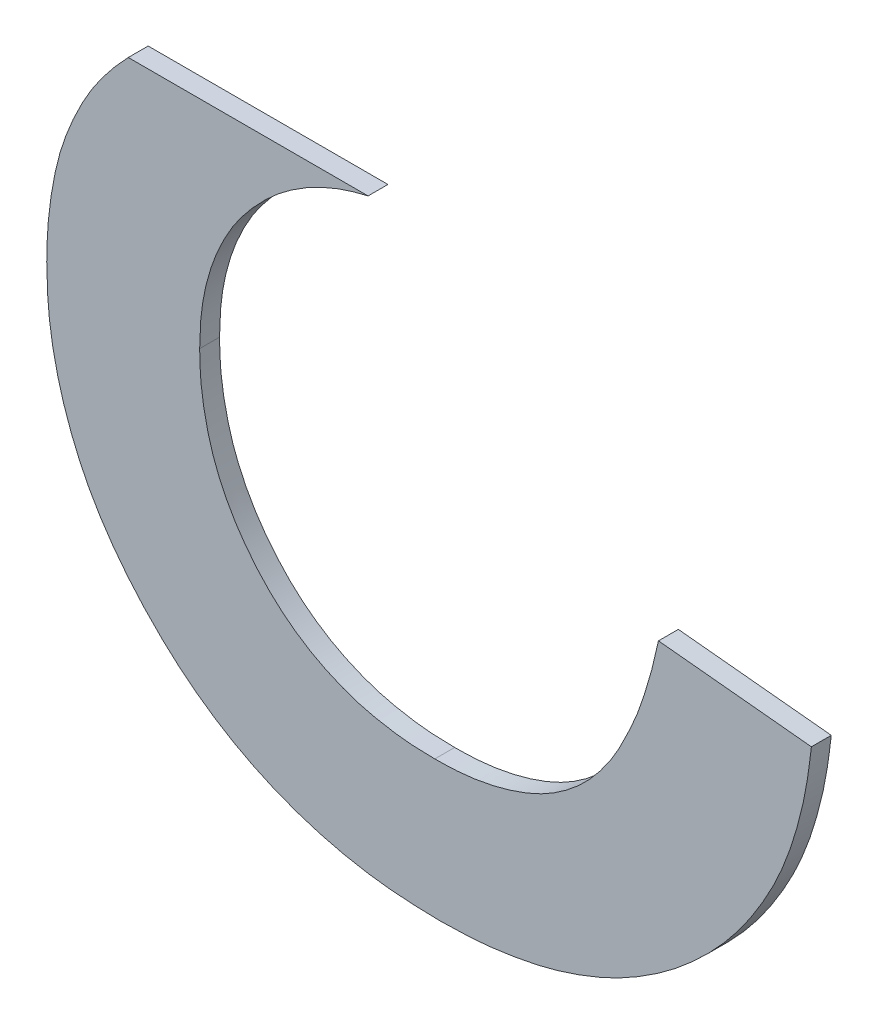
ISO-10303-21;
HEADER;
FILE_DESCRIPTION(('STEP AP214'),'2;1');
FILE_NAME('part.step','',(''),(''),'','','');
FILE_SCHEMA(('AUTOMOTIVE_DESIGN { 1 0 10303 214 1 1 1 1 }'));
ENDSEC;
DATA;
#1=APPLICATION_CONTEXT('core data for automotive mechanical design processes');
#2=APPLICATION_PROTOCOL_DEFINITION('international standard','automotive_design',2000,#1);
#3=PRODUCT_CONTEXT('',#1,'mechanical');
#4=PRODUCT('Part','Part','',(#3));
#5=PRODUCT_RELATED_PRODUCT_CATEGORY('part','',(#4));
#6=PRODUCT_DEFINITION_FORMATION('','',#4);
#7=PRODUCT_DEFINITION_CONTEXT('part definition',#1,'design');
#8=PRODUCT_DEFINITION('design','',#6,#7);
#9=PRODUCT_DEFINITION_SHAPE('','',#8);
#10=(LENGTH_UNIT() NAMED_UNIT(*) SI_UNIT(.MILLI.,.METRE.));
#11=(NAMED_UNIT(*) PLANE_ANGLE_UNIT() SI_UNIT($,.RADIAN.));
#12=(NAMED_UNIT(*) SI_UNIT($,.STERADIAN.) SOLID_ANGLE_UNIT());
#13=UNCERTAINTY_MEASURE_WITH_UNIT(LENGTH_MEASURE(1.E-05),#10,'distance_accuracy_value','');
#14=(GEOMETRIC_REPRESENTATION_CONTEXT(3) GLOBAL_UNCERTAINTY_ASSIGNED_CONTEXT((#13)) GLOBAL_UNIT_ASSIGNED_CONTEXT((#10,
#11,#12)) REPRESENTATION_CONTEXT('',''));
#15=CARTESIAN_POINT('',(0.,0.,0.));
#16=DIRECTION('',(0.,0.,1.));
#17=DIRECTION('',(1.,0.,0.));
#18=AXIS2_PLACEMENT_3D('',#15,#16,#17);
#19=CARTESIAN_POINT('',(0.144230769230785,-11.9230769230769,0.5));
#20=CARTESIAN_POINT('',(-0.0744822312694861,-11.9199586064738,0.5));
#21=CARTESIAN_POINT('',(-0.501629083204125,-11.9138685289871,0.5));
#22=CARTESIAN_POINT('',(-1.12405250213679,-11.8224940707849,0.5));
#23=CARTESIAN_POINT('',(-1.71639815462654,-11.6970282363729,0.5));
#24=CARTESIAN_POINT('',(-2.27021482228245,-11.5002906355349,0.5));
#25=CARTESIAN_POINT('',(-2.7932141049147,-11.2598409093781,0.5));
#26=CARTESIAN_POINT('',(-3.28241645200021,-10.9626960601933,0.5));
#27=CARTESIAN_POINT('',(-3.74117041997483,-10.6137736454766,0.5));
#28=CARTESIAN_POINT('',(-4.16042742320315,-10.2107002645114,0.5));
#29=CARTESIAN_POINT('',(-4.53536791821537,-9.76730670136257,0.5));
#30=CARTESIAN_POINT('',(-4.86930510805952,-9.29896993603157,0.5));
#31=CARTESIAN_POINT('',(-5.14542629997672,-8.80169379011726,0.5));
#32=CARTESIAN_POINT('',(-5.37815488450245,-8.28248254372084,0.5));
#33=CARTESIAN_POINT('',(-5.54993901659739,-7.73294599425316,0.5));
#34=CARTESIAN_POINT('',(-5.67569886688449,-7.15993658236351,0.5));
#35=CARTESIAN_POINT('',(-5.75788358000735,-6.56086291962811,0.5));
#36=CARTESIAN_POINT('',(-5.76539646364617,-6.15211821223777,0.5));
#37=CARTESIAN_POINT('',(-5.76923076923075,-5.94350961538462,0.5));
#38=B_SPLINE_CURVE_WITH_KNOTS('',3,(#19,#20,#21,#22,#23,#24,#25,#26,#27,#28,#29,#30,#31,#32,#33,
#34,#35,#36,#37),.UNSPECIFIED.,.F.,.F.,(4,1,1,1,1,1,1,1,1,1,1,1,1,1,1,1,4),(0.,
0.0694611184111808,0.135657679211247,0.199620200968317,0.261651428994339,0.322052934607597,
0.38234018970461,0.443223202981994,0.50492995824804,0.566820462633718,0.627600140217707,
0.687475643022949,0.747351145828191,0.808174179109678,0.870133448924472,0.933720783393158,1.),.UNSPECIFIED.);
#39=DIRECTION('',(0.,0.,-1.));
#40=VECTOR('',#39,1.);
#41=SURFACE_OF_LINEAR_EXTRUSION('',#38,#40);
#42=CARTESIAN_POINT('',(0.144230769230785,-11.9230769230769,0.));
#43=CARTESIAN_POINT('',(-0.0744822312694861,-11.9199586064738,0.));
#44=CARTESIAN_POINT('',(-0.501629083204125,-11.9138685289871,0.));
#45=CARTESIAN_POINT('',(-1.12405250213679,-11.8224940707849,0.));
#46=CARTESIAN_POINT('',(-1.71639815462654,-11.6970282363729,0.));
#47=CARTESIAN_POINT('',(-2.27021482228245,-11.5002906355349,0.));
#48=CARTESIAN_POINT('',(-2.7932141049147,-11.2598409093781,0.));
#49=CARTESIAN_POINT('',(-3.28241645200021,-10.9626960601933,0.));
#50=CARTESIAN_POINT('',(-3.74117041997483,-10.6137736454766,0.));
#51=CARTESIAN_POINT('',(-4.16042742320315,-10.2107002645114,0.));
#52=CARTESIAN_POINT('',(-4.53536791821537,-9.76730670136257,0.));
#53=CARTESIAN_POINT('',(-4.86930510805952,-9.29896993603157,0.));
#54=CARTESIAN_POINT('',(-5.14542629997672,-8.80169379011726,0.));
#55=CARTESIAN_POINT('',(-5.37815488450245,-8.28248254372084,0.));
#56=CARTESIAN_POINT('',(-5.54993901659739,-7.73294599425316,0.));
#57=CARTESIAN_POINT('',(-5.67569886688449,-7.15993658236351,0.));
#58=CARTESIAN_POINT('',(-5.75788358000735,-6.56086291962811,0.));
#59=CARTESIAN_POINT('',(-5.76539646364617,-6.15211821223777,0.));
#60=CARTESIAN_POINT('',(-5.76923076923075,-5.94350961538462,0.));
#61=B_SPLINE_CURVE_WITH_KNOTS('',3,(#42,#43,#44,#45,#46,#47,#48,#49,#50,#51,#52,#53,#54,#55,#56,
#57,#58,#59,#60),.UNSPECIFIED.,.F.,.F.,(4,1,1,1,1,1,1,1,1,1,1,1,1,1,1,1,4),(0.,
0.0694611184111808,0.135657679211247,0.199620200968317,0.261651428994339,0.322052934607597,
0.38234018970461,0.443223202981994,0.50492995824804,0.566820462633718,0.627600140217707,
0.687475643022949,0.747351145828191,0.808174179109678,0.870133448924472,0.933720783393158,1.),.UNSPECIFIED.);
#62=CARTESIAN_POINT('',(0.144230769230785,-11.9230769230769,0.));
#63=VERTEX_POINT('',#62);
#64=CARTESIAN_POINT('',(-5.76923076923075,-5.94350961538462,0.));
#65=VERTEX_POINT('',#64);
#66=EDGE_CURVE('E242',#63,#65,#61,.T.);
#67=ORIENTED_EDGE('',*,*,#66,.T.);
#68=DIRECTION('',(0.,0.,-1.));
#69=VECTOR('',#68,1.);
#70=CARTESIAN_POINT('',(-5.76923076923075,-5.94350961538462,0.5));
#71=LINE('',#70,#69);
#72=CARTESIAN_POINT('',(-5.76923076923075,-5.94350961538462,0.5));
#73=VERTEX_POINT('',#72);
#74=EDGE_CURVE('E49',#73,#65,#71,.T.);
#75=ORIENTED_EDGE('',*,*,#74,.F.);
#76=CARTESIAN_POINT('',(0.144230769230785,-11.9230769230769,0.5));
#77=VERTEX_POINT('',#76);
#78=EDGE_CURVE('E111',#77,#73,#38,.T.);
#79=ORIENTED_EDGE('',*,*,#78,.F.);
#80=DIRECTION('',(0.,0.,-1.));
#81=VECTOR('',#80,1.);
#82=CARTESIAN_POINT('',(0.144230769230785,-11.9230769230769,0.5));
#83=LINE('',#82,#81);
#84=EDGE_CURVE('E134',#77,#63,#83,.T.);
#85=ORIENTED_EDGE('',*,*,#84,.T.);
#86=EDGE_LOOP('',(#67,#75,#79,#85));
#87=FACE_BOUND('',#86,.T.);
#88=ADVANCED_FACE('F39',(#87),#41,.F.);
#89=CARTESIAN_POINT('',(5.76923076923079,-6.53846153846154,0.5));
#90=CARTESIAN_POINT('',(5.71795693225943,-6.76956124006788,0.5));
#91=CARTESIAN_POINT('',(5.61874586136115,-7.21672201903292,0.5));
#92=CARTESIAN_POINT('',(5.42785164181531,-7.85732629497525,0.5));
#93=CARTESIAN_POINT('',(5.22622542686346,-8.45195030263897,0.5));
#94=CARTESIAN_POINT('',(4.97627058440523,-8.98729374275372,0.5));
#95=CARTESIAN_POINT('',(4.73236898591528,-9.48524993811108,0.5));
#96=CARTESIAN_POINT('',(4.44574767245444,-9.92524380705293,0.5));
#97=CARTESIAN_POINT('',(4.13948723629215,-10.3187553810978,0.5));
#98=CARTESIAN_POINT('',(3.80792594555256,-10.6643234572396,0.5));
#99=CARTESIAN_POINT('',(3.44724315445093,-10.9618997724068,0.5));
#100=CARTESIAN_POINT('',(3.06224756680086,-11.2222950948592,0.5));
#101=CARTESIAN_POINT('',(2.64479687098295,-11.4397602537628,0.5));
#102=CARTESIAN_POINT('',(2.19808717707851,-11.6119396575782,0.5));
#103=CARTESIAN_POINT('',(1.72588085733184,-11.7513203507561,0.5));
#104=CARTESIAN_POINT('',(1.22561170073553,-11.8536650651945,0.5));
#105=CARTESIAN_POINT('',(0.694634366190034,-11.914633086874,0.5));
#106=CARTESIAN_POINT('',(0.330692505338732,-11.9202163815279,0.5));
#107=CARTESIAN_POINT('',(0.144230769230785,-11.9230769230769,0.5));
#108=B_SPLINE_CURVE_WITH_KNOTS('',3,(#89,#90,#91,#92,#93,#94,#95,#96,#97,#98,#99,#100,#101,#102,
#103,#104,#105,#106,#107),.UNSPECIFIED.,.F.,.F.,(4,1,1,1,1,1,1,1,1,1,1,1,1,1,1,1,4),(0.,
0.0825664818430902,0.159760017346322,0.233154500152942,0.301356279131653,0.365752014327156,
0.426437172317933,0.484185254035104,0.539549154293574,0.59315558981969,0.647048340420138,
0.701446374805587,0.756999674377037,0.813839623659105,0.873057952510779,0.934962594012761,1.),.UNSPECIFIED.);
#109=DIRECTION('',(0.,0.,-1.));
#110=VECTOR('',#109,1.);
#111=SURFACE_OF_LINEAR_EXTRUSION('',#108,#110);
#112=CARTESIAN_POINT('',(5.76923076923079,-6.53846153846154,0.));
#113=CARTESIAN_POINT('',(5.71795693225943,-6.76956124006788,0.));
#114=CARTESIAN_POINT('',(5.61874586136115,-7.21672201903292,0.));
#115=CARTESIAN_POINT('',(5.42785164181531,-7.85732629497525,0.));
#116=CARTESIAN_POINT('',(5.22622542686346,-8.45195030263897,0.));
#117=CARTESIAN_POINT('',(4.97627058440523,-8.98729374275372,0.));
#118=CARTESIAN_POINT('',(4.73236898591528,-9.48524993811108,0.));
#119=CARTESIAN_POINT('',(4.44574767245444,-9.92524380705293,0.));
#120=CARTESIAN_POINT('',(4.13948723629215,-10.3187553810978,0.));
#121=CARTESIAN_POINT('',(3.80792594555256,-10.6643234572396,0.));
#122=CARTESIAN_POINT('',(3.44724315445093,-10.9618997724068,0.));
#123=CARTESIAN_POINT('',(3.06224756680086,-11.2222950948592,0.));
#124=CARTESIAN_POINT('',(2.64479687098295,-11.4397602537628,0.));
#125=CARTESIAN_POINT('',(2.19808717707851,-11.6119396575782,0.));
#126=CARTESIAN_POINT('',(1.72588085733184,-11.7513203507561,0.));
#127=CARTESIAN_POINT('',(1.22561170073553,-11.8536650651945,0.));
#128=CARTESIAN_POINT('',(0.694634366190034,-11.914633086874,0.));
#129=CARTESIAN_POINT('',(0.330692505338732,-11.9202163815279,0.));
#130=CARTESIAN_POINT('',(0.144230769230785,-11.9230769230769,0.));
#131=B_SPLINE_CURVE_WITH_KNOTS('',3,(#112,#113,#114,#115,#116,#117,#118,#119,#120,#121,#122,
#123,#124,#125,#126,#127,#128,#129,#130),.UNSPECIFIED.,.F.,.F.,(4,1,1,1,1,1,1,1,1,1,1,1,1,1,1,1,
4),(0.,0.0825664818430902,0.159760017346322,0.233154500152942,0.301356279131653,
0.365752014327156,0.426437172317933,0.484185254035104,0.539549154293574,0.59315558981969,
0.647048340420138,0.701446374805587,0.756999674377037,0.813839623659105,0.873057952510779,
0.934962594012761,1.),.UNSPECIFIED.);
#132=CARTESIAN_POINT('',(5.76923076923079,-6.53846153846154,0.));
#133=VERTEX_POINT('',#132);
#134=EDGE_CURVE('E130',#133,#63,#131,.T.);
#135=ORIENTED_EDGE('',*,*,#134,.T.);
#136=ORIENTED_EDGE('',*,*,#84,.F.);
#137=CARTESIAN_POINT('',(5.76923076923079,-6.53846153846154,0.5));
#138=VERTEX_POINT('',#137);
#139=EDGE_CURVE('E198',#138,#77,#108,.T.);
#140=ORIENTED_EDGE('',*,*,#139,.F.);
#141=DIRECTION('',(0.,0.,-1.));
#142=VECTOR('',#141,1.);
#143=CARTESIAN_POINT('',(5.76923076923079,-6.53846153846154,0.5));
#144=LINE('',#143,#142);
#145=EDGE_CURVE('E132',#138,#133,#144,.T.);
#146=ORIENTED_EDGE('',*,*,#145,.T.);
#147=EDGE_LOOP('',(#135,#136,#140,#146));
#148=FACE_BOUND('',#147,.T.);
#149=ADVANCED_FACE('F182',(#148),#111,.F.);
#150=CARTESIAN_POINT('',(9.61538461538463,-6.92307692307692,0.5));
#151=DIRECTION('',(-0.0995037190209988,-0.995037190209989,0.));
#152=DIRECTION('',(0.995037190209989,-0.0995037190209988,0.));
#153=AXIS2_PLACEMENT_3D('',#150,#151,#152);
#154=PLANE('',#153);
#155=DIRECTION('',(-0.995037190209989,0.0995037190209988,0.));
#156=VECTOR('',#155,1.);
#157=CARTESIAN_POINT('',(9.61538461538463,-6.92307692307692,0.));
#158=LINE('',#157,#156);
#159=CARTESIAN_POINT('',(9.61538461538463,-6.92307692307692,0.));
#160=VERTEX_POINT('',#159);
#161=EDGE_CURVE('E136',#160,#133,#158,.T.);
#162=ORIENTED_EDGE('',*,*,#161,.T.);
#163=ORIENTED_EDGE('',*,*,#145,.F.);
#164=DIRECTION('',(-0.995037190209989,0.0995037190209988,0.));
#165=VECTOR('',#164,1.);
#166=CARTESIAN_POINT('',(9.61538461538463,-6.92307692307692,0.5));
#167=LINE('',#166,#165);
#168=CARTESIAN_POINT('',(9.61538461538463,-6.92307692307692,0.5));
#169=VERTEX_POINT('',#168);
#170=EDGE_CURVE('E210',#169,#138,#167,.T.);
#171=ORIENTED_EDGE('',*,*,#170,.F.);
#172=DIRECTION('',(0.,0.,-1.));
#173=VECTOR('',#172,1.);
#174=CARTESIAN_POINT('',(9.61538461538463,-6.92307692307692,0.5));
#175=LINE('',#174,#173);
#176=EDGE_CURVE('E141',#169,#160,#175,.T.);
#177=ORIENTED_EDGE('',*,*,#176,.T.);
#178=EDGE_LOOP('',(#162,#163,#171,#177));
#179=FACE_BOUND('',#178,.T.);
#180=ADVANCED_FACE('F192',(#179),#154,.F.);
#181=CARTESIAN_POINT('',(0.282451923076939,-15.3846153846154,0.5));
#182=CARTESIAN_POINT('',(0.597380180724391,-15.3786834155923,0.5));
#183=CARTESIAN_POINT('',(1.21736691226408,-15.3670053841775,0.5));
#184=CARTESIAN_POINT('',(2.1248994686703,-15.2453401908794,0.5));
#185=CARTESIAN_POINT('',(2.99436283611846,-15.0726833130998,0.5));
#186=CARTESIAN_POINT('',(3.81888178770487,-14.8065119740753,0.5));
#187=CARTESIAN_POINT('',(4.60803383126828,-14.481920338227,0.5));
#188=CARTESIAN_POINT('',(5.34845360637923,-14.0666543064892,0.5));
#189=CARTESIAN_POINT('',(6.05345441397882,-13.589944993764,0.5));
#190=CARTESIAN_POINT('',(6.70980076304187,-13.0381726799191,0.5));
#191=CARTESIAN_POINT('',(7.31384759442036,-12.4291602843919,0.5));
#192=CARTESIAN_POINT('',(7.85272962115041,-11.7719156141978,0.5));
#193=CARTESIAN_POINT('',(8.31547128664812,-11.0678979484096,0.5));
#194=CARTESIAN_POINT('',(8.72346876823684,-10.3276407378842,0.5));
#195=CARTESIAN_POINT('',(9.05323625393454,-9.53718975619581,0.5));
#196=CARTESIAN_POINT('',(9.31001244964092,-8.70333154961034,0.5));
#197=CARTESIAN_POINT('',(9.5058077485247,-7.82916080281444,0.5));
#198=CARTESIAN_POINT('',(9.57846157460332,-7.22839111029128,0.5));
#199=CARTESIAN_POINT('',(9.61538461538463,-6.92307692307692,0.5));
#200=B_SPLINE_CURVE_WITH_KNOTS('',3,(#181,#182,#183,#184,#185,#186,#187,#188,#189,#190,#191,
#192,#193,#194,#195,#196,#197,#198,#199),.UNSPECIFIED.,.F.,.F.,(4,1,1,1,1,1,1,1,1,1,1,1,1,1,1,1,
4),(0.,0.067794399401337,0.133464136929192,0.19693373355737,0.258480621611127,0.319786537680374,
0.3804313677831,0.440990172448991,0.502867428897312,0.564806339309781,0.625526341692538,
0.685603606858182,0.746040846000612,0.807346762069859,0.869717036358813,0.933789540905555,1.),.UNSPECIFIED.);
#201=DIRECTION('',(0.,0.,-1.));
#202=VECTOR('',#201,1.);
#203=SURFACE_OF_LINEAR_EXTRUSION('',#200,#202);
#204=CARTESIAN_POINT('',(0.282451923076939,-15.3846153846154,0.));
#205=CARTESIAN_POINT('',(0.597380180724391,-15.3786834155923,0.));
#206=CARTESIAN_POINT('',(1.21736691226408,-15.3670053841775,0.));
#207=CARTESIAN_POINT('',(2.1248994686703,-15.2453401908794,0.));
#208=CARTESIAN_POINT('',(2.99436283611846,-15.0726833130998,0.));
#209=CARTESIAN_POINT('',(3.81888178770487,-14.8065119740753,0.));
#210=CARTESIAN_POINT('',(4.60803383126828,-14.481920338227,0.));
#211=CARTESIAN_POINT('',(5.34845360637923,-14.0666543064892,0.));
#212=CARTESIAN_POINT('',(6.05345441397882,-13.589944993764,0.));
#213=CARTESIAN_POINT('',(6.70980076304187,-13.0381726799191,0.));
#214=CARTESIAN_POINT('',(7.31384759442036,-12.4291602843919,0.));
#215=CARTESIAN_POINT('',(7.85272962115041,-11.7719156141978,0.));
#216=CARTESIAN_POINT('',(8.31547128664812,-11.0678979484096,0.));
#217=CARTESIAN_POINT('',(8.72346876823684,-10.3276407378842,0.));
#218=CARTESIAN_POINT('',(9.05323625393454,-9.53718975619581,0.));
#219=CARTESIAN_POINT('',(9.31001244964092,-8.70333154961034,0.));
#220=CARTESIAN_POINT('',(9.5058077485247,-7.82916080281444,0.));
#221=CARTESIAN_POINT('',(9.57846157460332,-7.22839111029128,0.));
#222=CARTESIAN_POINT('',(9.61538461538463,-6.92307692307692,0.));
#223=B_SPLINE_CURVE_WITH_KNOTS('',3,(#204,#205,#206,#207,#208,#209,#210,#211,#212,#213,#214,
#215,#216,#217,#218,#219,#220,#221,#222),.UNSPECIFIED.,.F.,.F.,(4,1,1,1,1,1,1,1,1,1,1,1,1,1,1,1,
4),(0.,0.067794399401337,0.133464136929192,0.19693373355737,0.258480621611127,0.319786537680374,
0.3804313677831,0.440990172448991,0.502867428897312,0.564806339309781,0.625526341692538,
0.685603606858182,0.746040846000612,0.807346762069859,0.869717036358813,0.933789540905555,1.),.UNSPECIFIED.);
#224=CARTESIAN_POINT('',(0.282451923076939,-15.3846153846154,0.));
#225=VERTEX_POINT('',#224);
#226=EDGE_CURVE('E145',#225,#160,#223,.T.);
#227=ORIENTED_EDGE('',*,*,#226,.T.);
#228=ORIENTED_EDGE('',*,*,#176,.F.);
#229=CARTESIAN_POINT('',(0.282451923076939,-15.3846153846154,0.5));
#230=VERTEX_POINT('',#229);
#231=EDGE_CURVE('E157',#230,#169,#200,.T.);
#232=ORIENTED_EDGE('',*,*,#231,.F.);
#233=DIRECTION('',(0.,0.,-1.));
#234=VECTOR('',#233,1.);
#235=CARTESIAN_POINT('',(0.282451923076939,-15.3846153846154,0.5));
#236=LINE('',#235,#234);
#237=EDGE_CURVE('E150',#230,#225,#236,.T.);
#238=ORIENTED_EDGE('',*,*,#237,.T.);
#239=EDGE_LOOP('',(#227,#228,#232,#238));
#240=FACE_BOUND('',#239,.T.);
#241=ADVANCED_FACE('F173',(#240),#203,.F.);
#242=CARTESIAN_POINT('',(-9.6153846153846,-5.97355769230769,0.5));
#243=CARTESIAN_POINT('',(-9.6080643775137,-6.29654160388222,0.5));
#244=CARTESIAN_POINT('',(-9.59367776104854,-6.93130863497929,0.5));
#245=CARTESIAN_POINT('',(-9.45729218416612,-7.86379585033227,0.5));
#246=CARTESIAN_POINT('',(-9.23440754296136,-8.7572439649804,0.5));
#247=CARTESIAN_POINT('',(-8.92596509179117,-9.61468696016118,0.5));
#248=CARTESIAN_POINT('',(-8.53511970176737,-10.4396242134998,0.5));
#249=CARTESIAN_POINT('',(-8.04467320058395,-11.2204144611451,0.5));
#250=CARTESIAN_POINT('',(-7.4691613087434,-11.963404465501,0.5));
#251=CARTESIAN_POINT('',(-6.81758135054649,-12.6614803748239,0.5));
#252=CARTESIAN_POINT('',(-6.1037131421825,-13.3030336178044,0.5));
#253=CARTESIAN_POINT('',(-5.32847958733173,-13.8585573877607,0.5));
#254=CARTESIAN_POINT('',(-4.50721860775116,-14.3303169235018,0.5));
#255=CARTESIAN_POINT('',(-3.63859374465482,-14.7150344983663,0.5));
#256=CARTESIAN_POINT('',(-2.72490770021864,-15.0172894812292,0.5));
#257=CARTESIAN_POINT('',(-1.7652515428974,-15.2339555106521,0.5));
#258=CARTESIAN_POINT('',(-0.756655644294009,-15.3612923644151,0.5));
#259=CARTESIAN_POINT('',(-0.0684755195749816,-15.3767387334478,0.5));
#260=CARTESIAN_POINT('',(0.282451923076939,-15.3846153846154,0.5));
#261=B_SPLINE_CURVE_WITH_KNOTS('',3,(#242,#243,#244,#245,#246,#247,#248,#249,#250,#251,#252,
#253,#254,#255,#256,#257,#258,#259,#260),.UNSPECIFIED.,.F.,.F.,(4,1,1,1,1,1,1,1,1,1,1,1,1,1,1,1,
4),(0.,0.063503441454618,0.124804640578182,0.184920280113981,0.244376201568524,
0.303774637280874,0.364132596414621,0.425375506355363,0.488387997720841,0.551743328132024,
0.613859832281483,0.675640447138068,0.737736949192612,0.800417114076498,0.864658405836333,
0.930984523065555,1.),.UNSPECIFIED.);
#262=DIRECTION('',(0.,0.,-1.));
#263=VECTOR('',#262,1.);
#264=SURFACE_OF_LINEAR_EXTRUSION('',#261,#263);
#265=CARTESIAN_POINT('',(-9.6153846153846,-5.97355769230769,0.));
#266=CARTESIAN_POINT('',(-9.6080643775137,-6.29654160388222,0.));
#267=CARTESIAN_POINT('',(-9.59367776104854,-6.93130863497929,0.));
#268=CARTESIAN_POINT('',(-9.45729218416612,-7.86379585033227,0.));
#269=CARTESIAN_POINT('',(-9.23440754296136,-8.7572439649804,0.));
#270=CARTESIAN_POINT('',(-8.92596509179117,-9.61468696016118,0.));
#271=CARTESIAN_POINT('',(-8.53511970176737,-10.4396242134998,0.));
#272=CARTESIAN_POINT('',(-8.04467320058395,-11.2204144611451,0.));
#273=CARTESIAN_POINT('',(-7.4691613087434,-11.963404465501,0.));
#274=CARTESIAN_POINT('',(-6.81758135054649,-12.6614803748239,0.));
#275=CARTESIAN_POINT('',(-6.1037131421825,-13.3030336178044,0.));
#276=CARTESIAN_POINT('',(-5.32847958733173,-13.8585573877607,0.));
#277=CARTESIAN_POINT('',(-4.50721860775116,-14.3303169235018,0.));
#278=CARTESIAN_POINT('',(-3.63859374465482,-14.7150344983663,0.));
#279=CARTESIAN_POINT('',(-2.72490770021864,-15.0172894812292,0.));
#280=CARTESIAN_POINT('',(-1.7652515428974,-15.2339555106521,0.));
#281=CARTESIAN_POINT('',(-0.756655644294009,-15.3612923644151,0.));
#282=CARTESIAN_POINT('',(-0.0684755195749816,-15.3767387334478,0.));
#283=CARTESIAN_POINT('',(0.282451923076939,-15.3846153846154,0.));
#284=B_SPLINE_CURVE_WITH_KNOTS('',3,(#265,#266,#267,#268,#269,#270,#271,#272,#273,#274,#275,
#276,#277,#278,#279,#280,#281,#282,#283),.UNSPECIFIED.,.F.,.F.,(4,1,1,1,1,1,1,1,1,1,1,1,1,1,1,1,
4),(0.,0.063503441454618,0.124804640578182,0.184920280113981,0.244376201568524,
0.303774637280874,0.364132596414621,0.425375506355363,0.488387997720841,0.551743328132024,
0.613859832281483,0.675640447138068,0.737736949192612,0.800417114076498,0.864658405836333,
0.930984523065555,1.),.UNSPECIFIED.);
#285=CARTESIAN_POINT('',(-9.6153846153846,-5.97355769230769,0.));
#286=VERTEX_POINT('',#285);
#287=EDGE_CURVE('E119',#286,#225,#284,.T.);
#288=ORIENTED_EDGE('',*,*,#287,.T.);
#289=ORIENTED_EDGE('',*,*,#237,.F.);
#290=CARTESIAN_POINT('',(-9.6153846153846,-5.97355769230769,0.5));
#291=VERTEX_POINT('',#290);
#292=EDGE_CURVE('E149',#291,#230,#261,.T.);
#293=ORIENTED_EDGE('',*,*,#292,.F.);
#294=DIRECTION('',(0.,0.,-1.));
#295=VECTOR('',#294,1.);
#296=CARTESIAN_POINT('',(-9.6153846153846,-5.97355769230769,0.5));
#297=LINE('',#296,#295);
#298=EDGE_CURVE('E275',#291,#286,#297,.T.);
#299=ORIENTED_EDGE('',*,*,#298,.T.);
#300=EDGE_LOOP('',(#288,#289,#293,#299));
#301=FACE_BOUND('',#300,.T.);
#302=ADVANCED_FACE('F168',(#301),#264,.F.);
#303=CARTESIAN_POINT('',(6.6712729927265,-13.0558506104563,0.5));
#304=DIRECTION('',(0.,0.,-1.));
#305=DIRECTION('',(-1.,0.,0.));
#306=AXIS2_PLACEMENT_3D('',#303,#304,#305);
#307=PLANE('',#306);
#308=CARTESIAN_POINT('',(-5.76923076923075,-5.94350961538462,0.5));
#309=CARTESIAN_POINT('',(-5.76472433249919,-5.74498667668076,0.5));
#310=CARTESIAN_POINT('',(-5.75590784832191,-5.35659237489182,0.5));
#311=CARTESIAN_POINT('',(-5.68342922082397,-4.78651287138083,0.5));
#312=CARTESIAN_POINT('',(-5.55695561414025,-4.24535365767636,0.5));
#313=CARTESIAN_POINT('',(-5.38163296453216,-3.72998285024768,0.5));
#314=CARTESIAN_POINT('',(-5.15760660081573,-3.24115704898302,0.5));
#315=CARTESIAN_POINT('',(-4.88833351126671,-2.77483413303667,0.5));
#316=CARTESIAN_POINT('',(-4.55899044806538,-2.34123357495998,0.5));
#317=CARTESIAN_POINT('',(-4.18828578728159,-1.93569813305461,0.5));
#318=CARTESIAN_POINT('',(-3.78395515378696,-1.56208363596864,0.5));
#319=CARTESIAN_POINT('',(-3.34147738045667,-1.24427641770264,0.5));
#320=CARTESIAN_POINT('',(-2.8758244649698,-0.969998432949485,0.5));
#321=CARTESIAN_POINT('',(-2.38144689209208,-0.748529686093237,0.5));
#322=CARTESIAN_POINT('',(-1.86039733856275,-0.572748674710751,0.5));
#323=CARTESIAN_POINT('',(-1.31317252336509,-0.446411411575576,0.5));
#324=CARTESIAN_POINT('',(-0.737141504563648,-0.373901330518406,0.5));
#325=CARTESIAN_POINT('',(-0.344756329696519,-0.365083308458152,0.5));
#326=CARTESIAN_POINT('',(-0.144230769230752,-0.360576923076924,0.5));
#327=B_SPLINE_CURVE_WITH_KNOTS('',3,(#308,#309,#310,#311,#312,#313,#314,#315,#316,#317,#318,
#319,#320,#321,#322,#323,#324,#325,#326),.UNSPECIFIED.,.F.,.F.,(4,1,1,1,1,1,1,1,1,1,1,1,1,1,1,1,
4),(0.,0.0670509921880465,0.131179920391866,0.19372169126512,0.254499483759422,
0.314762713969885,0.375117068068399,0.436022821875003,0.498296746674327,0.56057067147365,
0.621619123462454,0.681973477560968,0.74285290837825,0.804271569680285,0.867472555769404,
0.932272823405128,1.),.UNSPECIFIED.);
#328=CARTESIAN_POINT('',(-1.53347417233713,-0.5,0.5));
#329=VERTEX_POINT('',#328);
#330=EDGE_CURVE('E160',#73,#329,#327,.T.);
#331=ORIENTED_EDGE('',*,*,#330,.T.);
#332=DIRECTION('',(-1.,0.,0.));
#333=VECTOR('',#332,1.);
#334=CARTESIAN_POINT('',(6.6712729927265,-0.5,0.5));
#335=LINE('',#334,#333);
#336=CARTESIAN_POINT('',(-7.56479888261555,-0.499999995226106,0.5));
#337=VERTEX_POINT('',#336);
#338=EDGE_CURVE('E277',#329,#337,#335,.T.);
#339=ORIENTED_EDGE('',*,*,#338,.T.);
#340=CARTESIAN_POINT('',(-3.98437499999998,1.42427884615384,0.5));
#341=CARTESIAN_POINT('',(-4.19980781435353,1.36988632262383,0.5));
#342=CARTESIAN_POINT('',(-4.62177781460573,1.26334724575874,0.5));
#343=CARTESIAN_POINT('',(-5.22782243598737,1.04260127920748,0.5));
#344=CARTESIAN_POINT('',(-5.79757241209382,0.784163298342848,0.5));
#345=CARTESIAN_POINT('',(-6.33861076027774,0.491451858864843,0.5));
#346=CARTESIAN_POINT('',(-6.83523011315003,0.145273143521969,0.5));
#347=CARTESIAN_POINT('',(-7.30454850547066,-0.233234039938428,0.5));
#348=CARTESIAN_POINT('',(-7.72882460582666,-0.662298857492223,0.5));
#349=CARTESIAN_POINT('',(-8.12035046471587,-1.1266286818268,0.5));
#350=CARTESIAN_POINT('',(-8.47659092188428,-1.6213642206543,0.5));
#351=CARTESIAN_POINT('',(-8.77637075945554,-2.15612918687906,0.5));
#352=CARTESIAN_POINT('',(-9.03507204743404,-2.71686556595007,0.5));
#353=CARTESIAN_POINT('',(-9.25566791173105,-3.30764034436966,0.5));
#354=CARTESIAN_POINT('',(-9.4141876024644,-3.93300884839882,0.5));
#355=CARTESIAN_POINT('',(-9.52753418707501,-4.58812633984064,0.5));
#356=CARTESIAN_POINT('',(-9.60233368970874,-5.27071672839264,0.5));
#357=CARTESIAN_POINT('',(-9.61099166837927,-5.73698113181403,0.5));
#358=CARTESIAN_POINT('',(-9.6153846153846,-5.97355769230769,0.5));
#359=B_SPLINE_CURVE_WITH_KNOTS('',3,(#340,#341,#342,#343,#344,#345,#346,#347,#348,#349,#350,
#351,#352,#353,#354,#355,#356,#357,#358),.UNSPECIFIED.,.F.,.F.,(4,1,1,1,1,1,1,1,1,1,1,1,1,1,1,1,
4),(0.,0.0658282446781898,0.128938316601441,0.190858323719115,0.251186231045244,
0.310974017780072,0.370049878512695,0.42967230953493,0.489507256826674,0.549975271732241,
0.610074807611578,0.670914865342259,0.732908854389039,0.796710708821786,0.861825383602173,
0.92989197705194,1.),.UNSPECIFIED.);
#360=EDGE_CURVE('E115',#337,#291,#359,.T.);
#361=ORIENTED_EDGE('',*,*,#360,.T.);
#362=ORIENTED_EDGE('',*,*,#292,.T.);
#363=ORIENTED_EDGE('',*,*,#231,.T.);
#364=ORIENTED_EDGE('',*,*,#170,.T.);
#365=ORIENTED_EDGE('',*,*,#139,.T.);
#366=ORIENTED_EDGE('',*,*,#78,.T.);
#367=EDGE_LOOP('',(#331,#339,#361,#362,#363,#364,#365,#366));
#368=FACE_BOUND('',#367,.T.);
#369=ADVANCED_FACE('F169',(#368),#307,.F.);
#370=DIRECTION('',(0.,0.,-1.));
#371=VECTOR('',#370,1.);
#372=SURFACE_OF_LINEAR_EXTRUSION('',#359,#371);
#373=ORIENTED_EDGE('',*,*,#360,.F.);
#374=DIRECTION('',(0.,0.,-1.));
#375=VECTOR('',#374,1.);
#376=CARTESIAN_POINT('',(-7.56479888727034,-0.5,0.5));
#377=LINE('',#376,#375);
#378=CARTESIAN_POINT('',(-7.56479888973119,-0.500000002523816,0.));
#379=VERTEX_POINT('',#378);
#380=EDGE_CURVE('E98',#337,#379,#377,.T.);
#381=ORIENTED_EDGE('',*,*,#380,.T.);
#382=CARTESIAN_POINT('',(-3.98437499999998,1.42427884615384,0.));
#383=CARTESIAN_POINT('',(-4.19980781435353,1.36988632262383,0.));
#384=CARTESIAN_POINT('',(-4.62177781460573,1.26334724575874,0.));
#385=CARTESIAN_POINT('',(-5.22782243598737,1.04260127920748,0.));
#386=CARTESIAN_POINT('',(-5.79757241209382,0.784163298342848,0.));
#387=CARTESIAN_POINT('',(-6.33861076027774,0.491451858864843,0.));
#388=CARTESIAN_POINT('',(-6.83523011315003,0.145273143521969,0.));
#389=CARTESIAN_POINT('',(-7.30454850547066,-0.233234039938428,0.));
#390=CARTESIAN_POINT('',(-7.72882460582666,-0.662298857492223,0.));
#391=CARTESIAN_POINT('',(-8.12035046471587,-1.1266286818268,0.));
#392=CARTESIAN_POINT('',(-8.47659092188428,-1.6213642206543,0.));
#393=CARTESIAN_POINT('',(-8.77637075945554,-2.15612918687906,0.));
#394=CARTESIAN_POINT('',(-9.03507204743404,-2.71686556595007,0.));
#395=CARTESIAN_POINT('',(-9.25566791173105,-3.30764034436966,0.));
#396=CARTESIAN_POINT('',(-9.4141876024644,-3.93300884839882,0.));
#397=CARTESIAN_POINT('',(-9.52753418707501,-4.58812633984064,0.));
#398=CARTESIAN_POINT('',(-9.60233368970874,-5.27071672839264,0.));
#399=CARTESIAN_POINT('',(-9.61099166837927,-5.73698113181403,0.));
#400=CARTESIAN_POINT('',(-9.6153846153846,-5.97355769230769,0.));
#401=B_SPLINE_CURVE_WITH_KNOTS('',3,(#382,#383,#384,#385,#386,#387,#388,#389,#390,#391,#392,
#393,#394,#395,#396,#397,#398,#399,#400),.UNSPECIFIED.,.F.,.F.,(4,1,1,1,1,1,1,1,1,1,1,1,1,1,1,1,
4),(0.,0.0658282446781898,0.128938316601441,0.190858323719115,0.251186231045244,
0.310974017780072,0.370049878512695,0.42967230953493,0.489507256826674,0.549975271732241,
0.610074807611578,0.670914865342259,0.732908854389039,0.796710708821786,0.861825383602173,
0.92989197705194,1.),.UNSPECIFIED.);
#402=EDGE_CURVE('E108',#379,#286,#401,.T.);
#403=ORIENTED_EDGE('',*,*,#402,.T.);
#404=ORIENTED_EDGE('',*,*,#298,.F.);
#405=EDGE_LOOP('',(#373,#381,#403,#404));
#406=FACE_BOUND('',#405,.T.);
#407=ADVANCED_FACE('F110',(#406),#372,.F.);
#408=DIRECTION('',(0.,0.,-1.));
#409=VECTOR('',#408,1.);
#410=SURFACE_OF_LINEAR_EXTRUSION('',#327,#409);
#411=CARTESIAN_POINT('',(-5.76923076923075,-5.94350961538462,0.));
#412=CARTESIAN_POINT('',(-5.76472433249919,-5.74498667668076,0.));
#413=CARTESIAN_POINT('',(-5.75590784832191,-5.35659237489182,0.));
#414=CARTESIAN_POINT('',(-5.68342922082397,-4.78651287138083,0.));
#415=CARTESIAN_POINT('',(-5.55695561414025,-4.24535365767636,0.));
#416=CARTESIAN_POINT('',(-5.38163296453216,-3.72998285024768,0.));
#417=CARTESIAN_POINT('',(-5.15760660081573,-3.24115704898302,0.));
#418=CARTESIAN_POINT('',(-4.88833351126671,-2.77483413303667,0.));
#419=CARTESIAN_POINT('',(-4.55899044806538,-2.34123357495998,0.));
#420=CARTESIAN_POINT('',(-4.18828578728159,-1.93569813305461,0.));
#421=CARTESIAN_POINT('',(-3.78395515378696,-1.56208363596864,0.));
#422=CARTESIAN_POINT('',(-3.34147738045667,-1.24427641770264,0.));
#423=CARTESIAN_POINT('',(-2.8758244649698,-0.969998432949485,0.));
#424=CARTESIAN_POINT('',(-2.38144689209208,-0.748529686093237,0.));
#425=CARTESIAN_POINT('',(-1.93050295466852,-0.596399469571225,0.));
#426=CARTESIAN_POINT('',(-1.64418398217089,-0.524326883223155,0.));
#427=CARTESIAN_POINT('',(-1.53357117994468,-0.500021312362204,0.));
#428=B_SPLINE_CURVE_WITH_KNOTS('',3,(#411,#412,#413,#414,#415,#416,#417,#418,#419,#420,#421,
#422,#423,#424,#425,#426,#427),.UNSPECIFIED.,.F.,.F.,(4,1,1,1,1,1,1,1,1,1,1,1,1,1,4),(0.,
0.0670509921880465,0.131179920391866,0.19372169126512,0.254499483759422,0.314762713969885,
0.375117068068399,0.436022821875003,0.498296746674327,0.56057067147365,0.621619123462454,
0.681973477560968,0.74285290837825,0.804271569680285,0.84251422488366),.UNSPECIFIED.);
#429=CARTESIAN_POINT('',(-1.53357585828562,-0.5,-1.2E-05));
#430=VERTEX_POINT('',#429);
#431=EDGE_CURVE('E120',#65,#430,#428,.T.);
#432=ORIENTED_EDGE('',*,*,#431,.T.);
#433=DIRECTION('',(0.,0.,-1.));
#434=VECTOR('',#433,1.);
#435=CARTESIAN_POINT('',(-1.533474184908,-0.5,0.5));
#436=LINE('',#435,#434);
#437=EDGE_CURVE('E57',#430,#329,#436,.F.);
#438=ORIENTED_EDGE('',*,*,#437,.T.);
#439=ORIENTED_EDGE('',*,*,#330,.F.);
#440=ORIENTED_EDGE('',*,*,#74,.T.);
#441=EDGE_LOOP('',(#432,#438,#439,#440));
#442=FACE_BOUND('',#441,.T.);
#443=ADVANCED_FACE('F185',(#442),#410,.F.);
#444=CARTESIAN_POINT('',(6.6712729927265,-13.0558506104563,0.));
#445=DIRECTION('',(0.,0.,-1.));
#446=DIRECTION('',(-1.,0.,0.));
#447=AXIS2_PLACEMENT_3D('',#444,#445,#446);
#448=PLANE('',#447);
#449=DIRECTION('',(-1.,0.,0.));
#450=VECTOR('',#449,1.);
#451=CARTESIAN_POINT('',(6.6712729927265,-0.5,0.));
#452=LINE('',#451,#450);
#453=EDGE_CURVE('E11',#430,#379,#452,.T.);
#454=ORIENTED_EDGE('',*,*,#453,.F.);
#455=ORIENTED_EDGE('',*,*,#431,.F.);
#456=ORIENTED_EDGE('',*,*,#66,.F.);
#457=ORIENTED_EDGE('',*,*,#134,.F.);
#458=ORIENTED_EDGE('',*,*,#161,.F.);
#459=ORIENTED_EDGE('',*,*,#226,.F.);
#460=ORIENTED_EDGE('',*,*,#287,.F.);
#461=ORIENTED_EDGE('',*,*,#402,.F.);
#462=EDGE_LOOP('',(#454,#455,#456,#457,#458,#459,#460,#461));
#463=FACE_BOUND('',#462,.T.);
#464=ADVANCED_FACE('F41',(#463),#448,.T.);
#465=CARTESIAN_POINT('',(-17.,-0.5,1.));
#466=DIRECTION('',(0.,-1.,0.));
#467=DIRECTION('',(0.,0.,-1.));
#468=AXIS2_PLACEMENT_3D('',#465,#466,#467);
#469=PLANE('',#468);
#470=ORIENTED_EDGE('',*,*,#453,.T.);
#471=ORIENTED_EDGE('',*,*,#380,.F.);
#472=ORIENTED_EDGE('',*,*,#338,.F.);
#473=ORIENTED_EDGE('',*,*,#437,.F.);
#474=EDGE_LOOP('',(#470,#471,#472,#473));
#475=FACE_BOUND('',#474,.T.);
#476=ADVANCED_FACE('F102',(#475),#469,.F.);
#477=CLOSED_SHELL('',(#88,#149,#180,#241,#302,#369,#407,#443,#464,#476));
#478=MANIFOLD_SOLID_BREP('B2',#477);
#479=ADVANCED_BREP_SHAPE_REPRESENTATION('',(#18,#478),#14);
#480=SHAPE_DEFINITION_REPRESENTATION(#9,#479);
ENDSEC;
END-ISO-10303-21;
